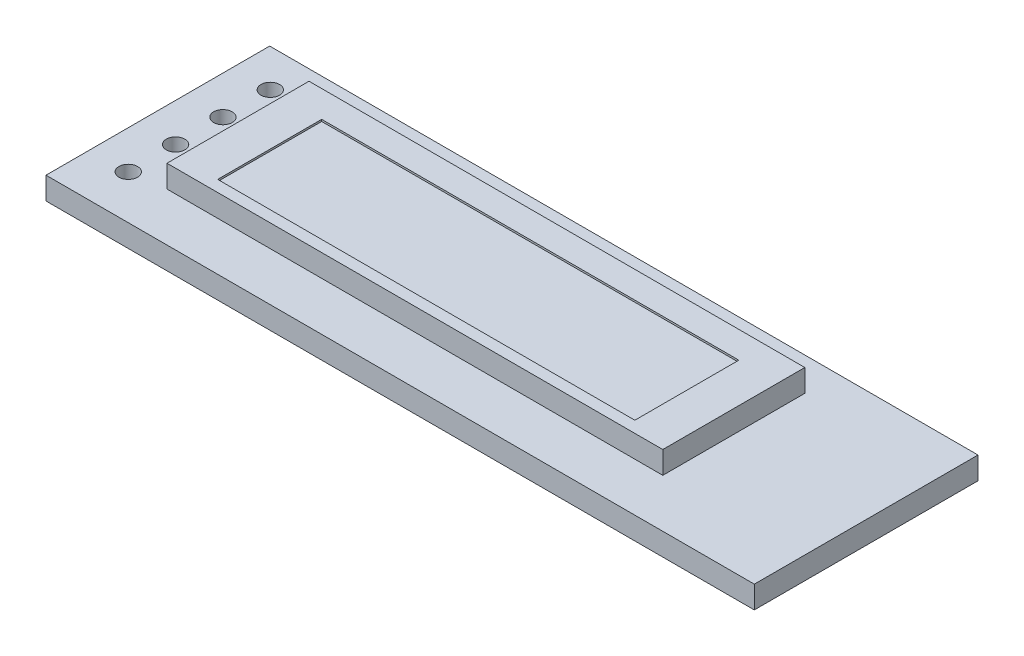
ISO-10303-21;
HEADER;
FILE_DESCRIPTION(('STEP AP214'),'2;1');
FILE_NAME('part.step','',(''),(''),'','','');
FILE_SCHEMA(('AUTOMOTIVE_DESIGN { 1 0 10303 214 1 1 1 1 }'));
ENDSEC;
DATA;
#1=APPLICATION_CONTEXT('core data for automotive mechanical design processes');
#2=APPLICATION_PROTOCOL_DEFINITION('international standard','automotive_design',2000,#1);
#3=PRODUCT_CONTEXT('',#1,'mechanical');
#4=PRODUCT('Part','Part','',(#3));
#5=PRODUCT_RELATED_PRODUCT_CATEGORY('part','',(#4));
#6=PRODUCT_DEFINITION_FORMATION('','',#4);
#7=PRODUCT_DEFINITION_CONTEXT('part definition',#1,'design');
#8=PRODUCT_DEFINITION('design','',#6,#7);
#9=PRODUCT_DEFINITION_SHAPE('','',#8);
#10=(LENGTH_UNIT() NAMED_UNIT(*) SI_UNIT(.MILLI.,.METRE.));
#11=(NAMED_UNIT(*) PLANE_ANGLE_UNIT() SI_UNIT($,.RADIAN.));
#12=(NAMED_UNIT(*) SI_UNIT($,.STERADIAN.) SOLID_ANGLE_UNIT());
#13=UNCERTAINTY_MEASURE_WITH_UNIT(LENGTH_MEASURE(1.E-05),#10,'distance_accuracy_value','');
#14=(GEOMETRIC_REPRESENTATION_CONTEXT(3) GLOBAL_UNCERTAINTY_ASSIGNED_CONTEXT((#13)) GLOBAL_UNIT_ASSIGNED_CONTEXT((#10,
#11,#12)) REPRESENTATION_CONTEXT('',''));
#15=CARTESIAN_POINT('',(0.,0.,0.));
#16=DIRECTION('',(0.,0.,1.));
#17=DIRECTION('',(1.,0.,0.));
#18=AXIS2_PLACEMENT_3D('',#15,#16,#17);
#19=CARTESIAN_POINT('',(0.,1.2,0.));
#20=DIRECTION('',(0.,-1.,0.));
#21=DIRECTION('',(0.,0.,-1.));
#22=AXIS2_PLACEMENT_3D('',#19,#20,#21);
#23=PLANE('',#22);
#24=CARTESIAN_POINT('',(-16.9486882946117,1.2,3.6389812036333));
#25=DIRECTION('',(0.,1.,0.));
#26=DIRECTION('',(0.,0.,1.));
#27=AXIS2_PLACEMENT_3D('',#24,#25,#26);
#28=CIRCLE('',#27,0.499999999999999);
#29=CARTESIAN_POINT('',(-16.9486882946117,1.2,4.1389812036333));
#30=VERTEX_POINT('',#29);
#31=EDGE_CURVE('E449',#30,#30,#28,.T.);
#32=ORIENTED_EDGE('',*,*,#31,.F.);
#33=EDGE_LOOP('',(#32));
#34=FACE_BOUND('',#33,.T.);
#35=CARTESIAN_POINT('',(-16.9486882946117,1.2,1.0989812036333));
#36=DIRECTION('',(0.,1.,0.));
#37=DIRECTION('',(0.,0.,1.));
#38=AXIS2_PLACEMENT_3D('',#35,#36,#37);
#39=CIRCLE('',#38,0.499999999999999);
#40=CARTESIAN_POINT('',(-16.9486882946117,1.2,1.5989812036333));
#41=VERTEX_POINT('',#40);
#42=EDGE_CURVE('E451',#41,#41,#39,.T.);
#43=ORIENTED_EDGE('',*,*,#42,.F.);
#44=EDGE_LOOP('',(#43));
#45=FACE_BOUND('',#44,.T.);
#46=CARTESIAN_POINT('',(-16.9486882946117,1.2,-1.4410187963667));
#47=DIRECTION('',(0.,1.,0.));
#48=DIRECTION('',(0.,0.,1.));
#49=AXIS2_PLACEMENT_3D('',#46,#47,#48);
#50=CIRCLE('',#49,0.499999999999999);
#51=CARTESIAN_POINT('',(-16.9486882946117,1.2,-0.941018796366698));
#52=VERTEX_POINT('',#51);
#53=EDGE_CURVE('E457',#52,#52,#50,.T.);
#54=ORIENTED_EDGE('',*,*,#53,.F.);
#55=EDGE_LOOP('',(#54));
#56=FACE_BOUND('',#55,.T.);
#57=CARTESIAN_POINT('',(-16.9486882946117,1.2,-3.9810187963667));
#58=DIRECTION('',(0.,1.,0.));
#59=DIRECTION('',(0.,0.,1.));
#60=AXIS2_PLACEMENT_3D('',#57,#58,#59);
#61=CIRCLE('',#60,0.499999999999999);
#62=CARTESIAN_POINT('',(-16.9486882946117,1.2,-3.4810187963667));
#63=VERTEX_POINT('',#62);
#64=EDGE_CURVE('E162',#63,#63,#61,.T.);
#65=ORIENTED_EDGE('',*,*,#64,.F.);
#66=EDGE_LOOP('',(#65));
#67=FACE_BOUND('',#66,.T.);
#68=DIRECTION('',(0.,0.,-1.));
#69=VECTOR('',#68,1.);
#70=CARTESIAN_POINT('',(19.,1.2,6.));
#71=LINE('',#70,#69);
#72=CARTESIAN_POINT('',(19.,1.2,6.));
#73=VERTEX_POINT('',#72);
#74=CARTESIAN_POINT('',(19.,1.2,-6.));
#75=VERTEX_POINT('',#74);
#76=EDGE_CURVE('E213',#73,#75,#71,.T.);
#77=ORIENTED_EDGE('',*,*,#76,.T.);
#78=DIRECTION('',(-1.,0.,0.));
#79=VECTOR('',#78,1.);
#80=CARTESIAN_POINT('',(-19.,1.2,-6.));
#81=LINE('',#80,#79);
#82=CARTESIAN_POINT('',(-19.,1.2,-6.));
#83=VERTEX_POINT('',#82);
#84=EDGE_CURVE('E216',#75,#83,#81,.T.);
#85=ORIENTED_EDGE('',*,*,#84,.T.);
#86=DIRECTION('',(0.,0.,1.));
#87=VECTOR('',#86,1.);
#88=CARTESIAN_POINT('',(-19.,1.2,6.));
#89=LINE('',#88,#87);
#90=CARTESIAN_POINT('',(-19.,1.2,6.));
#91=VERTEX_POINT('',#90);
#92=EDGE_CURVE('E219',#83,#91,#89,.T.);
#93=ORIENTED_EDGE('',*,*,#92,.T.);
#94=DIRECTION('',(1.,0.,0.));
#95=VECTOR('',#94,1.);
#96=CARTESIAN_POINT('',(-19.,1.2,6.));
#97=LINE('',#96,#95);
#98=EDGE_CURVE('E221',#91,#73,#97,.T.);
#99=ORIENTED_EDGE('',*,*,#98,.T.);
#100=EDGE_LOOP('',(#77,#85,#93,#99));
#101=FACE_BOUND('',#100,.T.);
#102=DIRECTION('',(0.,0.,1.));
#103=VECTOR('',#102,1.);
#104=CARTESIAN_POINT('',(-15.11,1.2,-4.22));
#105=LINE('',#104,#103);
#106=CARTESIAN_POINT('',(-15.11,1.2,-4.22));
#107=VERTEX_POINT('',#106);
#108=CARTESIAN_POINT('',(-15.11,1.2,3.4));
#109=VERTEX_POINT('',#108);
#110=EDGE_CURVE('E177',#107,#109,#105,.T.);
#111=ORIENTED_EDGE('',*,*,#110,.F.);
#112=DIRECTION('',(-1.,0.,0.));
#113=VECTOR('',#112,1.);
#114=CARTESIAN_POINT('',(11.49,1.2,-4.22));
#115=LINE('',#114,#113);
#116=CARTESIAN_POINT('',(11.49,1.2,-4.22));
#117=VERTEX_POINT('',#116);
#118=EDGE_CURVE('E185',#117,#107,#115,.T.);
#119=ORIENTED_EDGE('',*,*,#118,.F.);
#120=DIRECTION('',(0.,0.,-1.));
#121=VECTOR('',#120,1.);
#122=CARTESIAN_POINT('',(11.49,1.2,-4.22));
#123=LINE('',#122,#121);
#124=CARTESIAN_POINT('',(11.49,1.2,3.4));
#125=VERTEX_POINT('',#124);
#126=EDGE_CURVE('E197',#125,#117,#123,.T.);
#127=ORIENTED_EDGE('',*,*,#126,.F.);
#128=DIRECTION('',(1.,0.,0.));
#129=VECTOR('',#128,1.);
#130=CARTESIAN_POINT('',(11.49,1.2,3.4));
#131=LINE('',#130,#129);
#132=EDGE_CURVE('E64',#109,#125,#131,.T.);
#133=ORIENTED_EDGE('',*,*,#132,.F.);
#134=EDGE_LOOP('',(#111,#119,#127,#133));
#135=FACE_BOUND('',#134,.T.);
#136=ADVANCED_FACE('F41',(#34,#45,#56,#67,#101,#135),#23,.F.);
#137=CARTESIAN_POINT('',(19.,1.2,6.));
#138=DIRECTION('',(-1.,0.,0.));
#139=DIRECTION('',(0.,0.,1.));
#140=AXIS2_PLACEMENT_3D('',#137,#138,#139);
#141=PLANE('',#140);
#142=DIRECTION('',(0.,0.,-1.));
#143=VECTOR('',#142,1.);
#144=CARTESIAN_POINT('',(19.,0.,6.));
#145=LINE('',#144,#143);
#146=CARTESIAN_POINT('',(19.,0.,6.));
#147=VERTEX_POINT('',#146);
#148=CARTESIAN_POINT('',(19.,0.,-6.));
#149=VERTEX_POINT('',#148);
#150=EDGE_CURVE('E212',#147,#149,#145,.T.);
#151=ORIENTED_EDGE('',*,*,#150,.T.);
#152=DIRECTION('',(0.,-1.,0.));
#153=VECTOR('',#152,1.);
#154=CARTESIAN_POINT('',(19.,1.2,-6.));
#155=LINE('',#154,#153);
#156=EDGE_CURVE('E11',#75,#149,#155,.T.);
#157=ORIENTED_EDGE('',*,*,#156,.F.);
#158=ORIENTED_EDGE('',*,*,#76,.F.);
#159=DIRECTION('',(0.,-1.,0.));
#160=VECTOR('',#159,1.);
#161=CARTESIAN_POINT('',(19.,1.2,6.));
#162=LINE('',#161,#160);
#163=EDGE_CURVE('E223',#73,#147,#162,.T.);
#164=ORIENTED_EDGE('',*,*,#163,.T.);
#165=EDGE_LOOP('',(#151,#157,#158,#164));
#166=FACE_BOUND('',#165,.T.);
#167=ADVANCED_FACE('F43',(#166),#141,.F.);
#168=CARTESIAN_POINT('',(-19.,1.2,-6.));
#169=DIRECTION('',(0.,0.,1.));
#170=DIRECTION('',(1.,0.,0.));
#171=AXIS2_PLACEMENT_3D('',#168,#169,#170);
#172=PLANE('',#171);
#173=DIRECTION('',(-1.,0.,0.));
#174=VECTOR('',#173,1.);
#175=CARTESIAN_POINT('',(-19.,0.,-6.));
#176=LINE('',#175,#174);
#177=CARTESIAN_POINT('',(-19.,0.,-6.));
#178=VERTEX_POINT('',#177);
#179=EDGE_CURVE('E226',#149,#178,#176,.T.);
#180=ORIENTED_EDGE('',*,*,#179,.T.);
#181=DIRECTION('',(0.,-1.,0.));
#182=VECTOR('',#181,1.);
#183=CARTESIAN_POINT('',(-19.,1.2,-6.));
#184=LINE('',#183,#182);
#185=EDGE_CURVE('E49',#83,#178,#184,.T.);
#186=ORIENTED_EDGE('',*,*,#185,.F.);
#187=ORIENTED_EDGE('',*,*,#84,.F.);
#188=ORIENTED_EDGE('',*,*,#156,.T.);
#189=EDGE_LOOP('',(#180,#186,#187,#188));
#190=FACE_BOUND('',#189,.T.);
#191=ADVANCED_FACE('F255',(#190),#172,.F.);
#192=CARTESIAN_POINT('',(-19.,1.2,6.));
#193=DIRECTION('',(1.,0.,0.));
#194=DIRECTION('',(0.,0.,-1.));
#195=AXIS2_PLACEMENT_3D('',#192,#193,#194);
#196=PLANE('',#195);
#197=DIRECTION('',(0.,0.,1.));
#198=VECTOR('',#197,1.);
#199=CARTESIAN_POINT('',(-19.,0.,6.));
#200=LINE('',#199,#198);
#201=CARTESIAN_POINT('',(-19.,0.,6.));
#202=VERTEX_POINT('',#201);
#203=EDGE_CURVE('E228',#178,#202,#200,.T.);
#204=ORIENTED_EDGE('',*,*,#203,.T.);
#205=DIRECTION('',(0.,-1.,0.));
#206=VECTOR('',#205,1.);
#207=CARTESIAN_POINT('',(-19.,1.2,6.));
#208=LINE('',#207,#206);
#209=EDGE_CURVE('E233',#91,#202,#208,.T.);
#210=ORIENTED_EDGE('',*,*,#209,.F.);
#211=ORIENTED_EDGE('',*,*,#92,.F.);
#212=ORIENTED_EDGE('',*,*,#185,.T.);
#213=EDGE_LOOP('',(#204,#210,#211,#212));
#214=FACE_BOUND('',#213,.T.);
#215=ADVANCED_FACE('F240',(#214),#196,.F.);
#216=CARTESIAN_POINT('',(-19.,1.2,6.));
#217=DIRECTION('',(0.,0.,-1.));
#218=DIRECTION('',(-1.,0.,0.));
#219=AXIS2_PLACEMENT_3D('',#216,#217,#218);
#220=PLANE('',#219);
#221=DIRECTION('',(1.,0.,0.));
#222=VECTOR('',#221,1.);
#223=CARTESIAN_POINT('',(-19.,0.,6.));
#224=LINE('',#223,#222);
#225=EDGE_CURVE('E217',#202,#147,#224,.T.);
#226=ORIENTED_EDGE('',*,*,#225,.T.);
#227=ORIENTED_EDGE('',*,*,#163,.F.);
#228=ORIENTED_EDGE('',*,*,#98,.F.);
#229=ORIENTED_EDGE('',*,*,#209,.T.);
#230=EDGE_LOOP('',(#226,#227,#228,#229));
#231=FACE_BOUND('',#230,.T.);
#232=ADVANCED_FACE('F249',(#231),#220,.F.);
#233=CARTESIAN_POINT('',(0.,0.,0.));
#234=DIRECTION('',(0.,-1.,0.));
#235=DIRECTION('',(0.,0.,-1.));
#236=AXIS2_PLACEMENT_3D('',#233,#234,#235);
#237=PLANE('',#236);
#238=CARTESIAN_POINT('',(-16.9486882946117,0.,3.6389812036333));
#239=DIRECTION('',(0.,1.,0.));
#240=DIRECTION('',(0.,0.,1.));
#241=AXIS2_PLACEMENT_3D('',#238,#239,#240);
#242=CIRCLE('',#241,0.499999999999999);
#243=CARTESIAN_POINT('',(-16.9486882946117,0.,4.1389812036333));
#244=VERTEX_POINT('',#243);
#245=EDGE_CURVE('E447',#244,#244,#242,.T.);
#246=ORIENTED_EDGE('',*,*,#245,.T.);
#247=EDGE_LOOP('',(#246));
#248=FACE_BOUND('',#247,.T.);
#249=CARTESIAN_POINT('',(-16.9486882946117,0.,1.0989812036333));
#250=DIRECTION('',(0.,1.,0.));
#251=DIRECTION('',(0.,0.,1.));
#252=AXIS2_PLACEMENT_3D('',#249,#250,#251);
#253=CIRCLE('',#252,0.499999999999999);
#254=CARTESIAN_POINT('',(-16.9486882946117,0.,1.5989812036333));
#255=VERTEX_POINT('',#254);
#256=EDGE_CURVE('E454',#255,#255,#253,.T.);
#257=ORIENTED_EDGE('',*,*,#256,.T.);
#258=EDGE_LOOP('',(#257));
#259=FACE_BOUND('',#258,.T.);
#260=CARTESIAN_POINT('',(-16.9486882946117,0.,-1.4410187963667));
#261=DIRECTION('',(0.,1.,0.));
#262=DIRECTION('',(0.,0.,1.));
#263=AXIS2_PLACEMENT_3D('',#260,#261,#262);
#264=CIRCLE('',#263,0.499999999999999);
#265=CARTESIAN_POINT('',(-16.9486882946117,0.,-0.941018796366698));
#266=VERTEX_POINT('',#265);
#267=EDGE_CURVE('E460',#266,#266,#264,.T.);
#268=ORIENTED_EDGE('',*,*,#267,.T.);
#269=EDGE_LOOP('',(#268));
#270=FACE_BOUND('',#269,.T.);
#271=CARTESIAN_POINT('',(-16.9486882946117,0.,-3.9810187963667));
#272=DIRECTION('',(0.,1.,0.));
#273=DIRECTION('',(0.,0.,1.));
#274=AXIS2_PLACEMENT_3D('',#271,#272,#273);
#275=CIRCLE('',#274,0.499999999999999);
#276=CARTESIAN_POINT('',(-16.9486882946117,0.,-3.4810187963667));
#277=VERTEX_POINT('',#276);
#278=EDGE_CURVE('E171',#277,#277,#275,.T.);
#279=ORIENTED_EDGE('',*,*,#278,.T.);
#280=EDGE_LOOP('',(#279));
#281=FACE_BOUND('',#280,.T.);
#282=ORIENTED_EDGE('',*,*,#150,.F.);
#283=ORIENTED_EDGE('',*,*,#225,.F.);
#284=ORIENTED_EDGE('',*,*,#203,.F.);
#285=ORIENTED_EDGE('',*,*,#179,.F.);
#286=EDGE_LOOP('',(#282,#283,#284,#285));
#287=FACE_BOUND('',#286,.T.);
#288=ADVANCED_FACE('F246',(#248,#259,#270,#281,#287),#237,.T.);
#289=CARTESIAN_POINT('',(-15.11,2.4,-4.22));
#290=DIRECTION('',(1.,0.,0.));
#291=DIRECTION('',(0.,0.,-1.));
#292=AXIS2_PLACEMENT_3D('',#289,#290,#291);
#293=PLANE('',#292);
#294=ORIENTED_EDGE('',*,*,#110,.T.);
#295=DIRECTION('',(0.,-1.,0.));
#296=VECTOR('',#295,1.);
#297=CARTESIAN_POINT('',(-15.11,2.4,3.4));
#298=LINE('',#297,#296);
#299=CARTESIAN_POINT('',(-15.11,2.4,3.4));
#300=VERTEX_POINT('',#299);
#301=EDGE_CURVE('E210',#300,#109,#298,.T.);
#302=ORIENTED_EDGE('',*,*,#301,.F.);
#303=DIRECTION('',(0.,0.,1.));
#304=VECTOR('',#303,1.);
#305=CARTESIAN_POINT('',(-15.11,2.4,-4.22));
#306=LINE('',#305,#304);
#307=CARTESIAN_POINT('',(-15.11,2.4,-4.22));
#308=VERTEX_POINT('',#307);
#309=EDGE_CURVE('E181',#308,#300,#306,.T.);
#310=ORIENTED_EDGE('',*,*,#309,.F.);
#311=DIRECTION('',(0.,-1.,0.));
#312=VECTOR('',#311,1.);
#313=CARTESIAN_POINT('',(-15.11,2.4,-4.22));
#314=LINE('',#313,#312);
#315=EDGE_CURVE('E192',#308,#107,#314,.T.);
#316=ORIENTED_EDGE('',*,*,#315,.T.);
#317=EDGE_LOOP('',(#294,#302,#310,#316));
#318=FACE_BOUND('',#317,.T.);
#319=ADVANCED_FACE('F271',(#318),#293,.F.);
#320=CARTESIAN_POINT('',(11.49,2.4,3.4));
#321=DIRECTION('',(0.,0.,-1.));
#322=DIRECTION('',(-1.,0.,0.));
#323=AXIS2_PLACEMENT_3D('',#320,#321,#322);
#324=PLANE('',#323);
#325=ORIENTED_EDGE('',*,*,#132,.T.);
#326=DIRECTION('',(0.,-1.,0.));
#327=VECTOR('',#326,1.);
#328=CARTESIAN_POINT('',(11.49,2.4,3.4));
#329=LINE('',#328,#327);
#330=CARTESIAN_POINT('',(11.49,2.4,3.4));
#331=VERTEX_POINT('',#330);
#332=EDGE_CURVE('E207',#331,#125,#329,.T.);
#333=ORIENTED_EDGE('',*,*,#332,.F.);
#334=DIRECTION('',(1.,0.,0.));
#335=VECTOR('',#334,1.);
#336=CARTESIAN_POINT('',(11.49,2.4,3.4));
#337=LINE('',#336,#335);
#338=EDGE_CURVE('E184',#300,#331,#337,.T.);
#339=ORIENTED_EDGE('',*,*,#338,.F.);
#340=ORIENTED_EDGE('',*,*,#301,.T.);
#341=EDGE_LOOP('',(#325,#333,#339,#340));
#342=FACE_BOUND('',#341,.T.);
#343=ADVANCED_FACE('F291',(#342),#324,.F.);
#344=CARTESIAN_POINT('',(11.49,2.4,-4.22));
#345=DIRECTION('',(-1.,0.,0.));
#346=DIRECTION('',(0.,0.,1.));
#347=AXIS2_PLACEMENT_3D('',#344,#345,#346);
#348=PLANE('',#347);
#349=ORIENTED_EDGE('',*,*,#126,.T.);
#350=DIRECTION('',(0.,-1.,0.));
#351=VECTOR('',#350,1.);
#352=CARTESIAN_POINT('',(11.49,2.4,-4.22));
#353=LINE('',#352,#351);
#354=CARTESIAN_POINT('',(11.49,2.4,-4.22));
#355=VERTEX_POINT('',#354);
#356=EDGE_CURVE('E204',#355,#117,#353,.T.);
#357=ORIENTED_EDGE('',*,*,#356,.F.);
#358=DIRECTION('',(0.,0.,-1.));
#359=VECTOR('',#358,1.);
#360=CARTESIAN_POINT('',(11.49,2.4,-4.22));
#361=LINE('',#360,#359);
#362=EDGE_CURVE('E188',#331,#355,#361,.T.);
#363=ORIENTED_EDGE('',*,*,#362,.F.);
#364=ORIENTED_EDGE('',*,*,#332,.T.);
#365=EDGE_LOOP('',(#349,#357,#363,#364));
#366=FACE_BOUND('',#365,.T.);
#367=ADVANCED_FACE('F298',(#366),#348,.F.);
#368=CARTESIAN_POINT('',(11.49,2.4,-4.22));
#369=DIRECTION('',(0.,0.,1.));
#370=DIRECTION('',(1.,0.,0.));
#371=AXIS2_PLACEMENT_3D('',#368,#369,#370);
#372=PLANE('',#371);
#373=ORIENTED_EDGE('',*,*,#118,.T.);
#374=ORIENTED_EDGE('',*,*,#315,.F.);
#375=DIRECTION('',(-1.,0.,0.));
#376=VECTOR('',#375,1.);
#377=CARTESIAN_POINT('',(11.49,2.4,-4.22));
#378=LINE('',#377,#376);
#379=EDGE_CURVE('E190',#355,#308,#378,.T.);
#380=ORIENTED_EDGE('',*,*,#379,.F.);
#381=ORIENTED_EDGE('',*,*,#356,.T.);
#382=EDGE_LOOP('',(#373,#374,#380,#381));
#383=FACE_BOUND('',#382,.T.);
#384=ADVANCED_FACE('F305',(#383),#372,.F.);
#385=CARTESIAN_POINT('',(0.,2.4,0.));
#386=DIRECTION('',(0.,-1.,0.));
#387=DIRECTION('',(0.,0.,-1.));
#388=AXIS2_PLACEMENT_3D('',#385,#386,#387);
#389=PLANE('',#388);
#390=DIRECTION('',(-1.,0.,0.));
#391=VECTOR('',#390,1.);
#392=CARTESIAN_POINT('',(-13.,2.4,-2.79));
#393=LINE('',#392,#391);
#394=CARTESIAN_POINT('',(9.37999999999999,2.4,-2.79));
#395=VERTEX_POINT('',#394);
#396=CARTESIAN_POINT('',(-13.,2.4,-2.79));
#397=VERTEX_POINT('',#396);
#398=EDGE_CURVE('E170',#395,#397,#393,.T.);
#399=ORIENTED_EDGE('',*,*,#398,.F.);
#400=DIRECTION('',(0.,0.,-1.));
#401=VECTOR('',#400,1.);
#402=CARTESIAN_POINT('',(9.37999999999999,2.4,-2.79));
#403=LINE('',#402,#401);
#404=CARTESIAN_POINT('',(9.37999999999999,2.4,2.79));
#405=VERTEX_POINT('',#404);
#406=EDGE_CURVE('E56',#405,#395,#403,.T.);
#407=ORIENTED_EDGE('',*,*,#406,.F.);
#408=DIRECTION('',(1.,0.,0.));
#409=VECTOR('',#408,1.);
#410=CARTESIAN_POINT('',(-13.,2.4,2.79));
#411=LINE('',#410,#409);
#412=CARTESIAN_POINT('',(-13.,2.4,2.79));
#413=VERTEX_POINT('',#412);
#414=EDGE_CURVE('E153',#413,#405,#411,.T.);
#415=ORIENTED_EDGE('',*,*,#414,.F.);
#416=DIRECTION('',(0.,0.,1.));
#417=VECTOR('',#416,1.);
#418=CARTESIAN_POINT('',(-13.,2.4,-2.79));
#419=LINE('',#418,#417);
#420=EDGE_CURVE('E159',#397,#413,#419,.T.);
#421=ORIENTED_EDGE('',*,*,#420,.F.);
#422=EDGE_LOOP('',(#399,#407,#415,#421));
#423=FACE_BOUND('',#422,.T.);
#424=ORIENTED_EDGE('',*,*,#309,.T.);
#425=ORIENTED_EDGE('',*,*,#338,.T.);
#426=ORIENTED_EDGE('',*,*,#362,.T.);
#427=ORIENTED_EDGE('',*,*,#379,.T.);
#428=EDGE_LOOP('',(#424,#425,#426,#427));
#429=FACE_BOUND('',#428,.T.);
#430=ADVANCED_FACE('F313',(#423,#429),#389,.F.);
#431=CARTESIAN_POINT('',(9.37999999999999,2.3,-2.79));
#432=DIRECTION('',(1.,0.,0.));
#433=DIRECTION('',(0.,0.,-1.));
#434=AXIS2_PLACEMENT_3D('',#431,#432,#433);
#435=PLANE('',#434);
#436=ORIENTED_EDGE('',*,*,#406,.T.);
#437=DIRECTION('',(0.,1.,0.));
#438=VECTOR('',#437,1.);
#439=CARTESIAN_POINT('',(9.37999999999999,2.3,-2.79));
#440=LINE('',#439,#438);
#441=CARTESIAN_POINT('',(9.37999999999999,2.3,-2.79));
#442=VERTEX_POINT('',#441);
#443=EDGE_CURVE('E130',#442,#395,#440,.T.);
#444=ORIENTED_EDGE('',*,*,#443,.F.);
#445=DIRECTION('',(0.,0.,-1.));
#446=VECTOR('',#445,1.);
#447=CARTESIAN_POINT('',(9.37999999999999,2.3,-2.79));
#448=LINE('',#447,#446);
#449=CARTESIAN_POINT('',(9.37999999999999,2.3,2.79));
#450=VERTEX_POINT('',#449);
#451=EDGE_CURVE('E134',#450,#442,#448,.T.);
#452=ORIENTED_EDGE('',*,*,#451,.F.);
#453=DIRECTION('',(0.,1.,0.));
#454=VECTOR('',#453,1.);
#455=CARTESIAN_POINT('',(9.37999999999999,2.3,2.79));
#456=LINE('',#455,#454);
#457=EDGE_CURVE('E175',#450,#405,#456,.T.);
#458=ORIENTED_EDGE('',*,*,#457,.T.);
#459=EDGE_LOOP('',(#436,#444,#452,#458));
#460=FACE_BOUND('',#459,.T.);
#461=ADVANCED_FACE('F132',(#460),#435,.F.);
#462=CARTESIAN_POINT('',(-13.,2.3,2.79));
#463=DIRECTION('',(0.,0.,1.));
#464=DIRECTION('',(1.,0.,0.));
#465=AXIS2_PLACEMENT_3D('',#462,#463,#464);
#466=PLANE('',#465);
#467=ORIENTED_EDGE('',*,*,#414,.T.);
#468=ORIENTED_EDGE('',*,*,#457,.F.);
#469=DIRECTION('',(1.,0.,0.));
#470=VECTOR('',#469,1.);
#471=CARTESIAN_POINT('',(-13.,2.3,2.79));
#472=LINE('',#471,#470);
#473=CARTESIAN_POINT('',(-13.,2.3,2.79));
#474=VERTEX_POINT('',#473);
#475=EDGE_CURVE('E140',#474,#450,#472,.T.);
#476=ORIENTED_EDGE('',*,*,#475,.F.);
#477=DIRECTION('',(0.,1.,0.));
#478=VECTOR('',#477,1.);
#479=CARTESIAN_POINT('',(-13.,2.3,2.79));
#480=LINE('',#479,#478);
#481=EDGE_CURVE('E178',#474,#413,#480,.T.);
#482=ORIENTED_EDGE('',*,*,#481,.T.);
#483=EDGE_LOOP('',(#467,#468,#476,#482));
#484=FACE_BOUND('',#483,.T.);
#485=ADVANCED_FACE('F328',(#484),#466,.F.);
#486=CARTESIAN_POINT('',(-13.,2.3,-2.79));
#487=DIRECTION('',(-1.,0.,0.));
#488=DIRECTION('',(0.,0.,1.));
#489=AXIS2_PLACEMENT_3D('',#486,#487,#488);
#490=PLANE('',#489);
#491=ORIENTED_EDGE('',*,*,#420,.T.);
#492=ORIENTED_EDGE('',*,*,#481,.F.);
#493=DIRECTION('',(0.,0.,1.));
#494=VECTOR('',#493,1.);
#495=CARTESIAN_POINT('',(-13.,2.3,-2.79));
#496=LINE('',#495,#494);
#497=CARTESIAN_POINT('',(-13.,2.3,-2.79));
#498=VERTEX_POINT('',#497);
#499=EDGE_CURVE('E148',#498,#474,#496,.T.);
#500=ORIENTED_EDGE('',*,*,#499,.F.);
#501=DIRECTION('',(0.,1.,0.));
#502=VECTOR('',#501,1.);
#503=CARTESIAN_POINT('',(-13.,2.3,-2.79));
#504=LINE('',#503,#502);
#505=EDGE_CURVE('E139',#498,#397,#504,.T.);
#506=ORIENTED_EDGE('',*,*,#505,.T.);
#507=EDGE_LOOP('',(#491,#492,#500,#506));
#508=FACE_BOUND('',#507,.T.);
#509=ADVANCED_FACE('F335',(#508),#490,.F.);
#510=CARTESIAN_POINT('',(-13.,2.3,-2.79));
#511=DIRECTION('',(0.,0.,-1.));
#512=DIRECTION('',(-1.,0.,0.));
#513=AXIS2_PLACEMENT_3D('',#510,#511,#512);
#514=PLANE('',#513);
#515=ORIENTED_EDGE('',*,*,#398,.T.);
#516=ORIENTED_EDGE('',*,*,#505,.F.);
#517=DIRECTION('',(-1.,0.,0.));
#518=VECTOR('',#517,1.);
#519=CARTESIAN_POINT('',(-13.,2.3,-2.79));
#520=LINE('',#519,#518);
#521=EDGE_CURVE('E143',#442,#498,#520,.T.);
#522=ORIENTED_EDGE('',*,*,#521,.F.);
#523=ORIENTED_EDGE('',*,*,#443,.T.);
#524=EDGE_LOOP('',(#515,#516,#522,#523));
#525=FACE_BOUND('',#524,.T.);
#526=ADVANCED_FACE('F144',(#525),#514,.F.);
#527=CARTESIAN_POINT('',(0.,2.3,0.));
#528=DIRECTION('',(0.,1.,0.));
#529=DIRECTION('',(0.,0.,1.));
#530=AXIS2_PLACEMENT_3D('',#527,#528,#529);
#531=PLANE('',#530);
#532=ORIENTED_EDGE('',*,*,#451,.T.);
#533=ORIENTED_EDGE('',*,*,#521,.T.);
#534=ORIENTED_EDGE('',*,*,#499,.T.);
#535=ORIENTED_EDGE('',*,*,#475,.T.);
#536=EDGE_LOOP('',(#532,#533,#534,#535));
#537=FACE_BOUND('',#536,.T.);
#538=ADVANCED_FACE('F150',(#537),#531,.T.);
#539=CARTESIAN_POINT('',(-16.9486882946117,0.,-3.9810187963667));
#540=DIRECTION('',(0.,1.,0.));
#541=DIRECTION('',(0.,0.,1.));
#542=AXIS2_PLACEMENT_3D('',#539,#540,#541);
#543=CYLINDRICAL_SURFACE('',#542,0.499999999999999);
#544=ORIENTED_EDGE('',*,*,#278,.F.);
#545=EDGE_LOOP('',(#544));
#546=FACE_BOUND('',#545,.T.);
#547=ORIENTED_EDGE('',*,*,#64,.T.);
#548=EDGE_LOOP('',(#547));
#549=FACE_BOUND('',#548,.T.);
#550=ADVANCED_FACE('F356',(#546,#549),#543,.F.);
#551=CARTESIAN_POINT('',(-16.9486882946117,0.,-1.4410187963667));
#552=DIRECTION('',(0.,1.,0.));
#553=DIRECTION('',(0.,0.,1.));
#554=AXIS2_PLACEMENT_3D('',#551,#552,#553);
#555=CYLINDRICAL_SURFACE('',#554,0.499999999999999);
#556=ORIENTED_EDGE('',*,*,#267,.F.);
#557=EDGE_LOOP('',(#556));
#558=FACE_BOUND('',#557,.T.);
#559=ORIENTED_EDGE('',*,*,#53,.T.);
#560=EDGE_LOOP('',(#559));
#561=FACE_BOUND('',#560,.T.);
#562=ADVANCED_FACE('F362',(#558,#561),#555,.F.);
#563=CARTESIAN_POINT('',(-16.9486882946117,0.,1.0989812036333));
#564=DIRECTION('',(0.,1.,0.));
#565=DIRECTION('',(0.,0.,1.));
#566=AXIS2_PLACEMENT_3D('',#563,#564,#565);
#567=CYLINDRICAL_SURFACE('',#566,0.499999999999999);
#568=ORIENTED_EDGE('',*,*,#256,.F.);
#569=EDGE_LOOP('',(#568));
#570=FACE_BOUND('',#569,.T.);
#571=ORIENTED_EDGE('',*,*,#42,.T.);
#572=EDGE_LOOP('',(#571));
#573=FACE_BOUND('',#572,.T.);
#574=ADVANCED_FACE('F370',(#570,#573),#567,.F.);
#575=CARTESIAN_POINT('',(-16.9486882946117,0.,3.6389812036333));
#576=DIRECTION('',(0.,1.,0.));
#577=DIRECTION('',(0.,0.,1.));
#578=AXIS2_PLACEMENT_3D('',#575,#576,#577);
#579=CYLINDRICAL_SURFACE('',#578,0.499999999999999);
#580=ORIENTED_EDGE('',*,*,#245,.F.);
#581=EDGE_LOOP('',(#580));
#582=FACE_BOUND('',#581,.T.);
#583=ORIENTED_EDGE('',*,*,#31,.T.);
#584=EDGE_LOOP('',(#583));
#585=FACE_BOUND('',#584,.T.);
#586=ADVANCED_FACE('F378',(#582,#585),#579,.F.);
#587=CLOSED_SHELL('',(#136,#167,#191,#215,#232,#288,#319,#343,#367,#384,#430,#461,#485,#509,
#526,#538,#550,#562,#574,#586));
#588=MANIFOLD_SOLID_BREP('B2',#587);
#589=ADVANCED_BREP_SHAPE_REPRESENTATION('',(#18,#588),#14);
#590=SHAPE_DEFINITION_REPRESENTATION(#9,#589);
ENDSEC;
END-ISO-10303-21;
